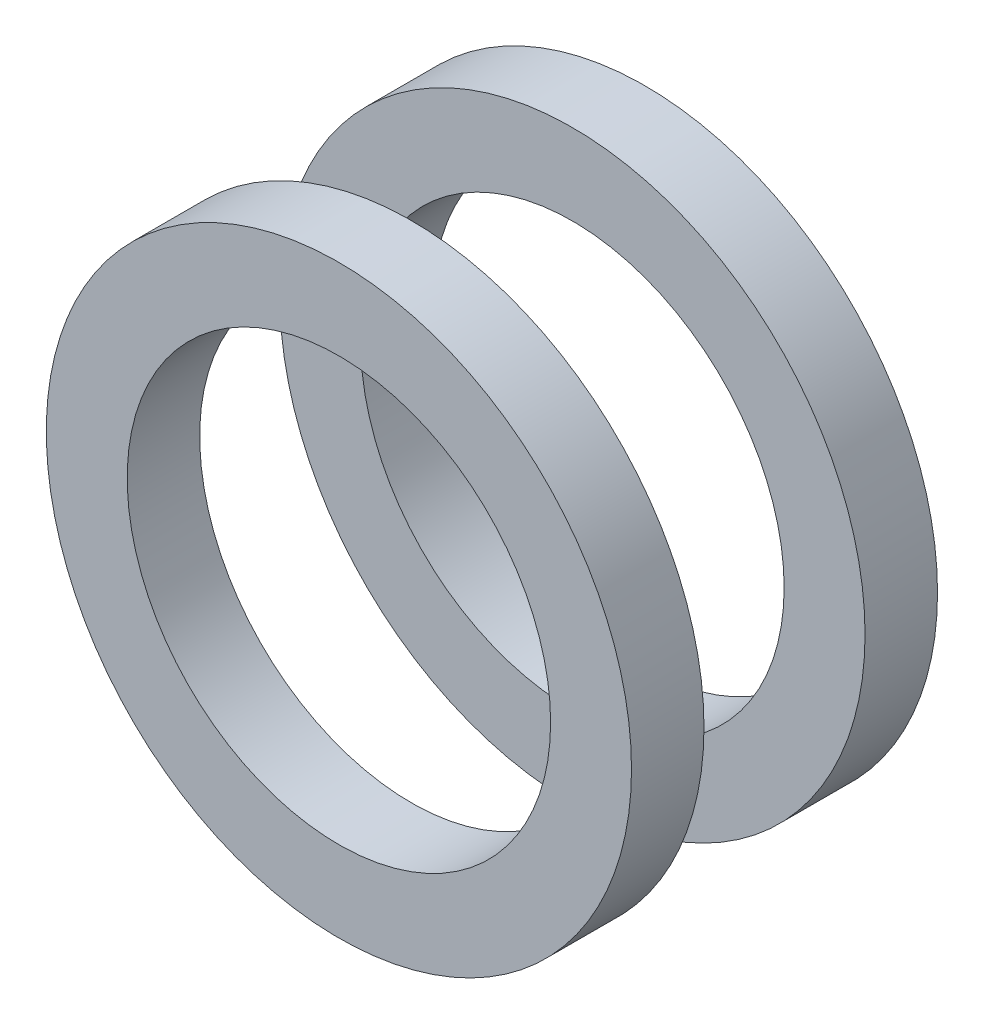
ISO-10303-21;
HEADER;
FILE_DESCRIPTION(('STEP AP214'),'2;1');
FILE_NAME('part.step','',(''),(''),'','','');
FILE_SCHEMA(('AUTOMOTIVE_DESIGN { 1 0 10303 214 1 1 1 1 }'));
ENDSEC;
DATA;
#1=APPLICATION_CONTEXT('core data for automotive mechanical design processes');
#2=APPLICATION_PROTOCOL_DEFINITION('international standard','automotive_design',2000,#1);
#3=PRODUCT_CONTEXT('',#1,'mechanical');
#4=PRODUCT('Part','Part','',(#3));
#5=PRODUCT_RELATED_PRODUCT_CATEGORY('part','',(#4));
#6=PRODUCT_DEFINITION_FORMATION('','',#4);
#7=PRODUCT_DEFINITION_CONTEXT('part definition',#1,'design');
#8=PRODUCT_DEFINITION('design','',#6,#7);
#9=PRODUCT_DEFINITION_SHAPE('','',#8);
#10=(LENGTH_UNIT() NAMED_UNIT(*) SI_UNIT(.MILLI.,.METRE.));
#11=(NAMED_UNIT(*) PLANE_ANGLE_UNIT() SI_UNIT($,.RADIAN.));
#12=(NAMED_UNIT(*) SI_UNIT($,.STERADIAN.) SOLID_ANGLE_UNIT());
#13=UNCERTAINTY_MEASURE_WITH_UNIT(LENGTH_MEASURE(1.E-05),#10,'distance_accuracy_value','');
#14=(GEOMETRIC_REPRESENTATION_CONTEXT(3) GLOBAL_UNCERTAINTY_ASSIGNED_CONTEXT((#13)) GLOBAL_UNIT_ASSIGNED_CONTEXT((#10,
#11,#12)) REPRESENTATION_CONTEXT('',''));
#15=CARTESIAN_POINT('',(0.,0.,0.));
#16=DIRECTION('',(0.,0.,1.));
#17=DIRECTION('',(1.,0.,0.));
#18=AXIS2_PLACEMENT_3D('',#15,#16,#17);
#19=CARTESIAN_POINT('',(0.,0.,-20.));
#20=DIRECTION('',(0.,0.,1.));
#21=DIRECTION('',(1.,0.,0.));
#22=AXIS2_PLACEMENT_3D('',#19,#20,#21);
#23=PLANE('',#22);
#24=CARTESIAN_POINT('',(0.,0.,-20.));
#25=DIRECTION('',(0.,0.,1.));
#26=DIRECTION('',(1.,0.,0.));
#27=AXIS2_PLACEMENT_3D('',#24,#25,#26);
#28=CIRCLE('',#27,72.6692307692308);
#29=CARTESIAN_POINT('',(72.6692307692308,0.,-20.));
#30=VERTEX_POINT('',#29);
#31=EDGE_CURVE('E11',#30,#30,#28,.T.);
#32=ORIENTED_EDGE('',*,*,#31,.T.);
#33=EDGE_LOOP('',(#32));
#34=FACE_BOUND('',#33,.T.);
#35=CARTESIAN_POINT('',(0.,0.,-20.));
#36=DIRECTION('',(0.,0.,1.));
#37=DIRECTION('',(1.,0.,0.));
#38=AXIS2_PLACEMENT_3D('',#35,#36,#37);
#39=CIRCLE('',#38,52.5769230769231);
#40=CARTESIAN_POINT('',(52.5769230769231,0.,-20.));
#41=VERTEX_POINT('',#40);
#42=EDGE_CURVE('E54',#41,#41,#39,.T.);
#43=ORIENTED_EDGE('',*,*,#42,.F.);
#44=EDGE_LOOP('',(#43));
#45=FACE_BOUND('',#44,.T.);
#46=ADVANCED_FACE('F43',(#34,#45),#23,.T.);
#47=CARTESIAN_POINT('',(0.,0.,-38.));
#48=DIRECTION('',(0.,0.,1.));
#49=DIRECTION('',(1.,0.,0.));
#50=AXIS2_PLACEMENT_3D('',#47,#48,#49);
#51=PLANE('',#50);
#52=CARTESIAN_POINT('',(0.,0.,-38.));
#53=DIRECTION('',(0.,0.,1.));
#54=DIRECTION('',(1.,0.,0.));
#55=AXIS2_PLACEMENT_3D('',#52,#53,#54);
#56=CIRCLE('',#55,72.6692307692308);
#57=CARTESIAN_POINT('',(72.6692307692308,0.,-38.));
#58=VERTEX_POINT('',#57);
#59=EDGE_CURVE('E47',#58,#58,#56,.T.);
#60=ORIENTED_EDGE('',*,*,#59,.F.);
#61=EDGE_LOOP('',(#60));
#62=FACE_BOUND('',#61,.T.);
#63=CARTESIAN_POINT('',(0.,0.,-38.));
#64=DIRECTION('',(0.,0.,1.));
#65=DIRECTION('',(1.,0.,0.));
#66=AXIS2_PLACEMENT_3D('',#63,#64,#65);
#67=CIRCLE('',#66,52.5769230769231);
#68=CARTESIAN_POINT('',(52.5769230769231,0.,-38.));
#69=VERTEX_POINT('',#68);
#70=EDGE_CURVE('E56',#69,#69,#67,.T.);
#71=ORIENTED_EDGE('',*,*,#70,.T.);
#72=EDGE_LOOP('',(#71));
#73=FACE_BOUND('',#72,.T.);
#74=ADVANCED_FACE('F66',(#62,#73),#51,.F.);
#75=CARTESIAN_POINT('',(0.,0.,-20.));
#76=DIRECTION('',(0.,0.,-1.));
#77=DIRECTION('',(-1.,0.,0.));
#78=AXIS2_PLACEMENT_3D('',#75,#76,#77);
#79=CYLINDRICAL_SURFACE('',#78,72.6692307692308);
#80=ORIENTED_EDGE('',*,*,#31,.F.);
#81=EDGE_LOOP('',(#80));
#82=FACE_BOUND('',#81,.T.);
#83=ORIENTED_EDGE('',*,*,#59,.T.);
#84=EDGE_LOOP('',(#83));
#85=FACE_BOUND('',#84,.T.);
#86=ADVANCED_FACE('F45',(#82,#85),#79,.T.);
#87=CARTESIAN_POINT('',(0.,0.,-20.));
#88=DIRECTION('',(0.,0.,-1.));
#89=DIRECTION('',(-1.,0.,0.));
#90=AXIS2_PLACEMENT_3D('',#87,#88,#89);
#91=CYLINDRICAL_SURFACE('',#90,52.5769230769231);
#92=ORIENTED_EDGE('',*,*,#42,.T.);
#93=EDGE_LOOP('',(#92));
#94=FACE_BOUND('',#93,.T.);
#95=ORIENTED_EDGE('',*,*,#70,.F.);
#96=EDGE_LOOP('',(#95));
#97=FACE_BOUND('',#96,.T.);
#98=ADVANCED_FACE('F62',(#94,#97),#91,.F.);
#99=CLOSED_SHELL('',(#46,#74,#86,#98));
#100=MANIFOLD_SOLID_BREP('B2',#99);
#101=CARTESIAN_POINT('',(0.,0.,38.));
#102=DIRECTION('',(0.,0.,1.));
#103=DIRECTION('',(1.,0.,0.));
#104=AXIS2_PLACEMENT_3D('',#101,#102,#103);
#105=PLANE('',#104);
#106=CARTESIAN_POINT('',(0.,0.,38.));
#107=DIRECTION('',(0.,0.,1.));
#108=DIRECTION('',(1.,0.,0.));
#109=AXIS2_PLACEMENT_3D('',#106,#107,#108);
#110=CIRCLE('',#109,72.6692307692308);
#111=CARTESIAN_POINT('',(72.6692307692308,0.,38.));
#112=VERTEX_POINT('',#111);
#113=EDGE_CURVE('E42',#112,#112,#110,.T.);
#114=ORIENTED_EDGE('',*,*,#113,.T.);
#115=EDGE_LOOP('',(#114));
#116=FACE_BOUND('',#115,.T.);
#117=CARTESIAN_POINT('',(0.,0.,38.));
#118=DIRECTION('',(0.,0.,1.));
#119=DIRECTION('',(1.,0.,0.));
#120=AXIS2_PLACEMENT_3D('',#117,#118,#119);
#121=CIRCLE('',#120,52.5769230769231);
#122=CARTESIAN_POINT('',(52.5769230769231,0.,38.));
#123=VERTEX_POINT('',#122);
#124=EDGE_CURVE('E116',#123,#123,#121,.T.);
#125=ORIENTED_EDGE('',*,*,#124,.F.);
#126=EDGE_LOOP('',(#125));
#127=FACE_BOUND('',#126,.T.);
#128=ADVANCED_FACE('F105',(#116,#127),#105,.T.);
#129=CARTESIAN_POINT('',(0.,0.,20.));
#130=DIRECTION('',(0.,0.,1.));
#131=DIRECTION('',(1.,0.,0.));
#132=AXIS2_PLACEMENT_3D('',#129,#130,#131);
#133=PLANE('',#132);
#134=CARTESIAN_POINT('',(0.,0.,20.));
#135=DIRECTION('',(0.,0.,1.));
#136=DIRECTION('',(1.,0.,0.));
#137=AXIS2_PLACEMENT_3D('',#134,#135,#136);
#138=CIRCLE('',#137,72.6692307692308);
#139=CARTESIAN_POINT('',(72.6692307692308,0.,20.));
#140=VERTEX_POINT('',#139);
#141=EDGE_CURVE('E109',#140,#140,#138,.T.);
#142=ORIENTED_EDGE('',*,*,#141,.F.);
#143=EDGE_LOOP('',(#142));
#144=FACE_BOUND('',#143,.T.);
#145=CARTESIAN_POINT('',(0.,0.,20.));
#146=DIRECTION('',(0.,0.,1.));
#147=DIRECTION('',(1.,0.,0.));
#148=AXIS2_PLACEMENT_3D('',#145,#146,#147);
#149=CIRCLE('',#148,52.5769230769231);
#150=CARTESIAN_POINT('',(52.5769230769231,0.,20.));
#151=VERTEX_POINT('',#150);
#152=EDGE_CURVE('E118',#151,#151,#149,.T.);
#153=ORIENTED_EDGE('',*,*,#152,.T.);
#154=EDGE_LOOP('',(#153));
#155=FACE_BOUND('',#154,.T.);
#156=ADVANCED_FACE('F128',(#144,#155),#133,.F.);
#157=CARTESIAN_POINT('',(0.,0.,38.));
#158=DIRECTION('',(0.,0.,-1.));
#159=DIRECTION('',(-1.,0.,0.));
#160=AXIS2_PLACEMENT_3D('',#157,#158,#159);
#161=CYLINDRICAL_SURFACE('',#160,72.6692307692308);
#162=ORIENTED_EDGE('',*,*,#113,.F.);
#163=EDGE_LOOP('',(#162));
#164=FACE_BOUND('',#163,.T.);
#165=ORIENTED_EDGE('',*,*,#141,.T.);
#166=EDGE_LOOP('',(#165));
#167=FACE_BOUND('',#166,.T.);
#168=ADVANCED_FACE('F107',(#164,#167),#161,.T.);
#169=CARTESIAN_POINT('',(0.,0.,38.));
#170=DIRECTION('',(0.,0.,-1.));
#171=DIRECTION('',(-1.,0.,0.));
#172=AXIS2_PLACEMENT_3D('',#169,#170,#171);
#173=CYLINDRICAL_SURFACE('',#172,52.5769230769231);
#174=ORIENTED_EDGE('',*,*,#124,.T.);
#175=EDGE_LOOP('',(#174));
#176=FACE_BOUND('',#175,.T.);
#177=ORIENTED_EDGE('',*,*,#152,.F.);
#178=EDGE_LOOP('',(#177));
#179=FACE_BOUND('',#178,.T.);
#180=ADVANCED_FACE('F124',(#176,#179),#173,.F.);
#181=CLOSED_SHELL('',(#128,#156,#168,#180));
#182=MANIFOLD_SOLID_BREP('B6',#181);
#183=ADVANCED_BREP_SHAPE_REPRESENTATION('',(#18,#100,#182),#14);
#184=SHAPE_DEFINITION_REPRESENTATION(#9,#183);
ENDSEC;
END-ISO-10303-21;
